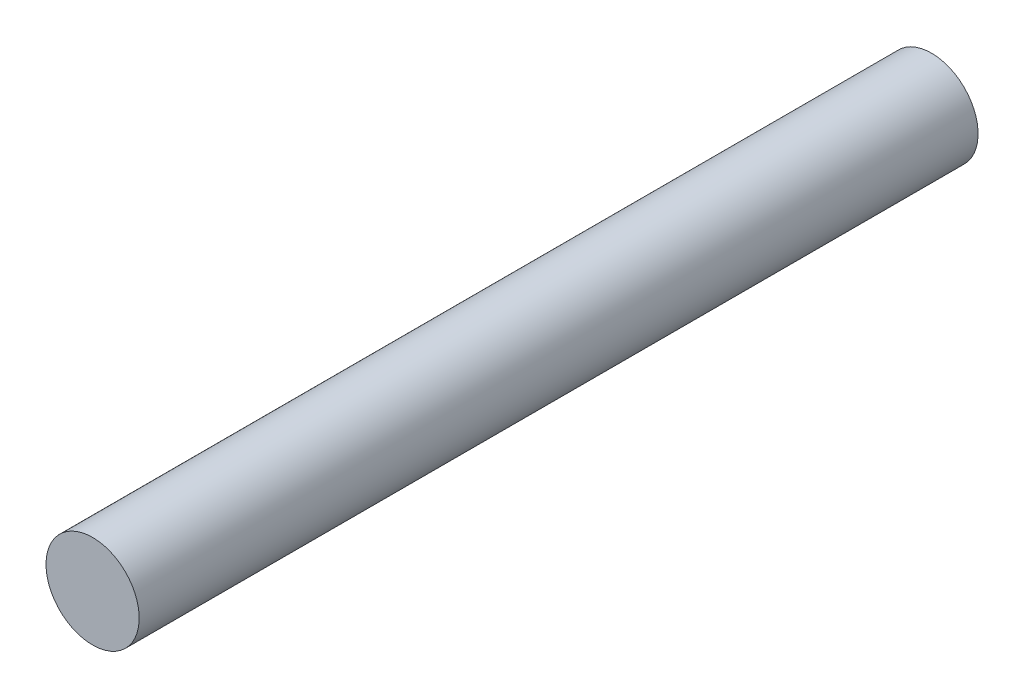
ISO-10303-21;
HEADER;
FILE_DESCRIPTION(('STEP AP214'),'2;1');
FILE_NAME('part.step','',(''),(''),'','','');
FILE_SCHEMA(('AUTOMOTIVE_DESIGN { 1 0 10303 214 1 1 1 1 }'));
ENDSEC;
DATA;
#1=APPLICATION_CONTEXT('core data for automotive mechanical design processes');
#2=APPLICATION_PROTOCOL_DEFINITION('international standard','automotive_design',2000,#1);
#3=PRODUCT_CONTEXT('',#1,'mechanical');
#4=PRODUCT('Part','Part','',(#3));
#5=PRODUCT_RELATED_PRODUCT_CATEGORY('part','',(#4));
#6=PRODUCT_DEFINITION_FORMATION('','',#4);
#7=PRODUCT_DEFINITION_CONTEXT('part definition',#1,'design');
#8=PRODUCT_DEFINITION('design','',#6,#7);
#9=PRODUCT_DEFINITION_SHAPE('','',#8);
#10=(LENGTH_UNIT() NAMED_UNIT(*) SI_UNIT(.MILLI.,.METRE.));
#11=(NAMED_UNIT(*) PLANE_ANGLE_UNIT() SI_UNIT($,.RADIAN.));
#12=(NAMED_UNIT(*) SI_UNIT($,.STERADIAN.) SOLID_ANGLE_UNIT());
#13=UNCERTAINTY_MEASURE_WITH_UNIT(LENGTH_MEASURE(1.E-05),#10,'distance_accuracy_value','');
#14=(GEOMETRIC_REPRESENTATION_CONTEXT(3) GLOBAL_UNCERTAINTY_ASSIGNED_CONTEXT((#13)) GLOBAL_UNIT_ASSIGNED_CONTEXT((#10,
#11,#12)) REPRESENTATION_CONTEXT('',''));
#15=CARTESIAN_POINT('',(0.,0.,0.));
#16=DIRECTION('',(0.,0.,1.));
#17=DIRECTION('',(1.,0.,0.));
#18=AXIS2_PLACEMENT_3D('',#15,#16,#17);
#19=CARTESIAN_POINT('',(0.,0.,45.));
#20=DIRECTION('',(0.,0.,-1.));
#21=DIRECTION('',(-1.,0.,0.));
#22=AXIS2_PLACEMENT_3D('',#19,#20,#21);
#23=CYLINDRICAL_SURFACE('',#22,2.5);
#24=CARTESIAN_POINT('',(0.,0.,45.));
#25=DIRECTION('',(0.,0.,1.));
#26=DIRECTION('',(1.,0.,0.));
#27=AXIS2_PLACEMENT_3D('',#24,#25,#26);
#28=CIRCLE('',#27,2.5);
#29=CARTESIAN_POINT('',(-2.5,0.,45.));
#30=VERTEX_POINT('',#29);
#31=EDGE_CURVE('E12',#30,#30,#28,.T.);
#32=CARTESIAN_POINT('',(0.,0.,0.));
#33=DIRECTION('',(0.,0.,1.));
#34=DIRECTION('',(1.,0.,0.));
#35=AXIS2_PLACEMENT_3D('',#32,#33,#34);
#36=CIRCLE('',#35,2.5);
#37=CARTESIAN_POINT('',(-2.5,0.,0.));
#38=VERTEX_POINT('',#37);
#39=EDGE_CURVE('E43',#38,#38,#36,.T.);
#40=CARTESIAN_POINT('',(-2.5,0.,45.));
#41=CARTESIAN_POINT('',(-2.5,0.,44.53125));
#42=CARTESIAN_POINT('',(-2.5,0.,44.0625));
#43=CARTESIAN_POINT('',(-2.5,0.,43.125));
#44=CARTESIAN_POINT('',(-2.5,0.,42.65625));
#45=CARTESIAN_POINT('',(-2.5,0.,41.71875));
#46=CARTESIAN_POINT('',(-2.5,0.,41.25));
#47=CARTESIAN_POINT('',(-2.5,0.,40.3125));
#48=CARTESIAN_POINT('',(-2.5,0.,39.84375));
#49=CARTESIAN_POINT('',(-2.5,0.,38.90625));
#50=CARTESIAN_POINT('',(-2.5,0.,38.4375));
#51=CARTESIAN_POINT('',(-2.5,0.,37.5));
#52=CARTESIAN_POINT('',(-2.5,0.,37.03125));
#53=CARTESIAN_POINT('',(-2.5,0.,36.09375));
#54=CARTESIAN_POINT('',(-2.5,0.,35.625));
#55=CARTESIAN_POINT('',(-2.5,0.,34.6875));
#56=CARTESIAN_POINT('',(-2.5,0.,34.21875));
#57=CARTESIAN_POINT('',(-2.5,0.,33.28125));
#58=CARTESIAN_POINT('',(-2.5,0.,32.8125));
#59=CARTESIAN_POINT('',(-2.5,0.,31.875));
#60=CARTESIAN_POINT('',(-2.5,0.,31.40625));
#61=CARTESIAN_POINT('',(-2.5,0.,30.46875));
#62=CARTESIAN_POINT('',(-2.5,0.,30.));
#63=CARTESIAN_POINT('',(-2.5,0.,29.0625));
#64=CARTESIAN_POINT('',(-2.5,0.,28.59375));
#65=CARTESIAN_POINT('',(-2.5,0.,27.65625));
#66=CARTESIAN_POINT('',(-2.5,0.,27.1875));
#67=CARTESIAN_POINT('',(-2.5,0.,26.25));
#68=CARTESIAN_POINT('',(-2.5,0.,25.78125));
#69=CARTESIAN_POINT('',(-2.5,0.,24.84375));
#70=CARTESIAN_POINT('',(-2.5,0.,24.375));
#71=CARTESIAN_POINT('',(-2.5,0.,23.4375));
#72=CARTESIAN_POINT('',(-2.5,0.,22.96875));
#73=CARTESIAN_POINT('',(-2.5,0.,22.03125));
#74=CARTESIAN_POINT('',(-2.5,0.,21.5625));
#75=CARTESIAN_POINT('',(-2.5,0.,20.625));
#76=CARTESIAN_POINT('',(-2.5,0.,20.15625));
#77=CARTESIAN_POINT('',(-2.5,0.,19.21875));
#78=CARTESIAN_POINT('',(-2.5,0.,18.75));
#79=CARTESIAN_POINT('',(-2.5,0.,17.8125));
#80=CARTESIAN_POINT('',(-2.5,0.,17.34375));
#81=CARTESIAN_POINT('',(-2.5,0.,16.40625));
#82=CARTESIAN_POINT('',(-2.5,0.,15.9375));
#83=CARTESIAN_POINT('',(-2.5,0.,15.));
#84=CARTESIAN_POINT('',(-2.5,0.,14.53125));
#85=CARTESIAN_POINT('',(-2.5,0.,13.59375));
#86=CARTESIAN_POINT('',(-2.5,0.,13.125));
#87=CARTESIAN_POINT('',(-2.5,0.,12.1875));
#88=CARTESIAN_POINT('',(-2.5,0.,11.71875));
#89=CARTESIAN_POINT('',(-2.5,0.,10.78125));
#90=CARTESIAN_POINT('',(-2.5,0.,10.3125));
#91=CARTESIAN_POINT('',(-2.5,0.,9.37499999999999));
#92=CARTESIAN_POINT('',(-2.5,0.,8.90624999999999));
#93=CARTESIAN_POINT('',(-2.5,0.,7.96874999999999));
#94=CARTESIAN_POINT('',(-2.5,0.,7.5));
#95=CARTESIAN_POINT('',(-2.5,0.,6.56249999999999));
#96=CARTESIAN_POINT('',(-2.5,0.,6.09374999999999));
#97=CARTESIAN_POINT('',(-2.5,0.,5.15624999999999));
#98=CARTESIAN_POINT('',(-2.5,0.,4.68749999999999));
#99=CARTESIAN_POINT('',(-2.5,0.,3.74999999999999));
#100=CARTESIAN_POINT('',(-2.5,0.,3.28124999999999));
#101=CARTESIAN_POINT('',(-2.5,0.,2.34374999999999));
#102=CARTESIAN_POINT('',(-2.5,0.,1.87499999999999));
#103=CARTESIAN_POINT('',(-2.5,0.,0.937499999999992));
#104=CARTESIAN_POINT('',(-2.5,0.,0.468749999999993));
#105=CARTESIAN_POINT('',(-2.5,0.,0.));
#106=B_SPLINE_CURVE_WITH_KNOTS('',3,(#40,#41,#42,#43,#44,#45,#46,#47,#48,#49,#50,#51,#52,#53,
#54,#55,#56,#57,#58,#59,#60,#61,#62,#63,#64,#65,#66,#67,#68,#69,#70,#71,#72,#73,#74,#75,#76,#77,
#78,#79,#80,#81,#82,#83,#84,#85,#86,#87,#88,#89,#90,#91,#92,#93,#94,#95,#96,#97,#98,#99,#100,
#101,#102,#103,#104,#105),.UNSPECIFIED.,.F.,.F.,(4,2,2,2,2,2,2,2,2,2,2,2,2,2,2,2,2,2,2,2,2,2,2,
2,2,2,2,2,2,2,2,2,4),(0.,1.40625,2.8125,4.21874999999999,5.625,7.03125,8.43749999999999,9.84375,
11.25,12.65625,14.0625,15.46875,16.875,18.28125,19.6875,21.09375,22.5,23.90625,25.3125,26.71875,
28.125,29.53125,30.9375,32.34375,33.75,35.15625,36.5625,37.96875,39.375,40.78125,42.1875,
43.59375,45.),.UNSPECIFIED.);
#107=EDGE_CURVE('BSEAM40',#30,#38,#106,.T.);
#108=ORIENTED_EDGE('',*,*,#31,.F.);
#109=ORIENTED_EDGE('',*,*,#39,.T.);
#110=ORIENTED_EDGE('',*,*,#107,.T.);
#111=ORIENTED_EDGE('',*,*,#107,.F.);
#112=EDGE_LOOP('',(#108,#110,#109,#111));
#113=FACE_BOUND('',#112,.T.);
#114=ADVANCED_FACE('F40',(#113),#23,.T.);
#115=CARTESIAN_POINT('',(0.,0.,45.));
#116=DIRECTION('',(0.,0.,1.));
#117=DIRECTION('',(1.,0.,0.));
#118=AXIS2_PLACEMENT_3D('',#115,#116,#117);
#119=PLANE('',#118);
#120=ORIENTED_EDGE('',*,*,#31,.T.);
#121=EDGE_LOOP('',(#120));
#122=FACE_BOUND('',#121,.T.);
#123=ADVANCED_FACE('F55',(#122),#119,.T.);
#124=CARTESIAN_POINT('',(0.,0.,0.));
#125=DIRECTION('',(0.,0.,1.));
#126=DIRECTION('',(1.,0.,0.));
#127=AXIS2_PLACEMENT_3D('',#124,#125,#126);
#128=PLANE('',#127);
#129=ORIENTED_EDGE('',*,*,#39,.F.);
#130=EDGE_LOOP('',(#129));
#131=FACE_BOUND('',#130,.T.);
#132=ADVANCED_FACE('F53',(#131),#128,.F.);
#133=CLOSED_SHELL('',(#114,#123,#132));
#134=MANIFOLD_SOLID_BREP('B2',#133);
#135=ADVANCED_BREP_SHAPE_REPRESENTATION('',(#18,#134),#14);
#136=SHAPE_DEFINITION_REPRESENTATION(#9,#135);
ENDSEC;
END-ISO-10303-21;
